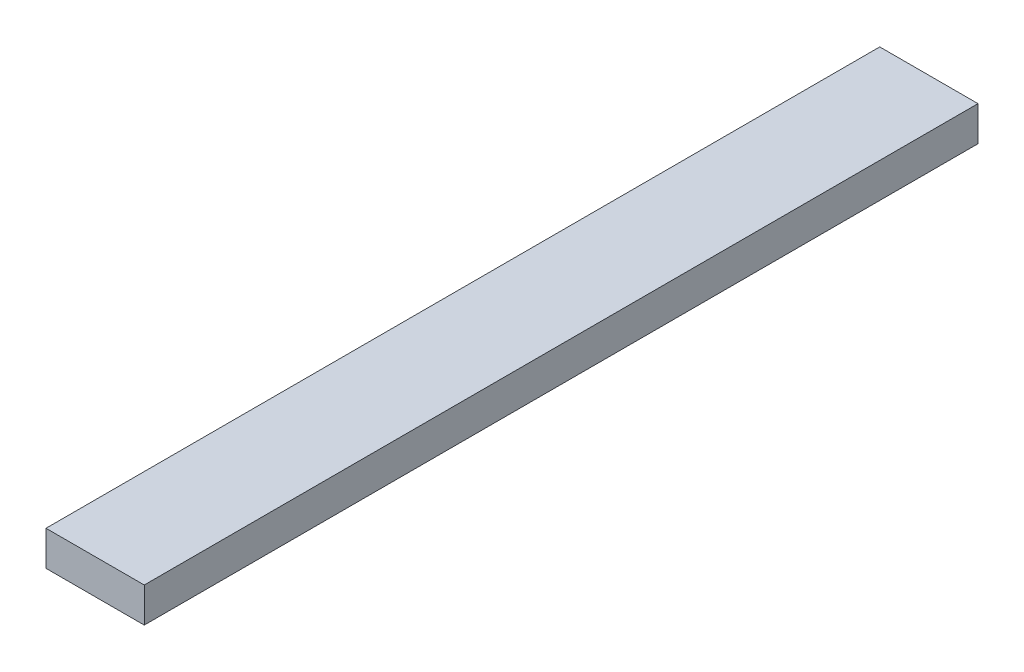
ISO-10303-21;
HEADER;
FILE_DESCRIPTION(('STEP AP214'),'2;1');
FILE_NAME('part.step','',(''),(''),'','','');
FILE_SCHEMA(('AUTOMOTIVE_DESIGN { 1 0 10303 214 1 1 1 1 }'));
ENDSEC;
DATA;
#1=APPLICATION_CONTEXT('core data for automotive mechanical design processes');
#2=APPLICATION_PROTOCOL_DEFINITION('international standard','automotive_design',2000,#1);
#3=PRODUCT_CONTEXT('',#1,'mechanical');
#4=PRODUCT('Part','Part','',(#3));
#5=PRODUCT_RELATED_PRODUCT_CATEGORY('part','',(#4));
#6=PRODUCT_DEFINITION_FORMATION('','',#4);
#7=PRODUCT_DEFINITION_CONTEXT('part definition',#1,'design');
#8=PRODUCT_DEFINITION('design','',#6,#7);
#9=PRODUCT_DEFINITION_SHAPE('','',#8);
#10=(LENGTH_UNIT() NAMED_UNIT(*) SI_UNIT(.MILLI.,.METRE.));
#11=(NAMED_UNIT(*) PLANE_ANGLE_UNIT() SI_UNIT($,.RADIAN.));
#12=(NAMED_UNIT(*) SI_UNIT($,.STERADIAN.) SOLID_ANGLE_UNIT());
#13=UNCERTAINTY_MEASURE_WITH_UNIT(LENGTH_MEASURE(1.E-05),#10,'distance_accuracy_value','');
#14=(GEOMETRIC_REPRESENTATION_CONTEXT(3) GLOBAL_UNCERTAINTY_ASSIGNED_CONTEXT((#13)) GLOBAL_UNIT_ASSIGNED_CONTEXT((#10,
#11,#12)) REPRESENTATION_CONTEXT('',''));
#15=CARTESIAN_POINT('',(0.,0.,0.));
#16=DIRECTION('',(0.,0.,1.));
#17=DIRECTION('',(1.,0.,0.));
#18=AXIS2_PLACEMENT_3D('',#15,#16,#17);
#19=CARTESIAN_POINT('',(0.,0.,152.4));
#20=DIRECTION('',(1.,0.,0.));
#21=DIRECTION('',(0.,0.,-1.));
#22=AXIS2_PLACEMENT_3D('',#19,#20,#21);
#23=PLANE('',#22);
#24=DIRECTION('',(0.,-1.,0.));
#25=VECTOR('',#24,1.);
#26=CARTESIAN_POINT('',(0.,0.,0.));
#27=LINE('',#26,#25);
#28=CARTESIAN_POINT('',(0.,6.35,0.));
#29=VERTEX_POINT('',#28);
#30=CARTESIAN_POINT('',(0.,0.,0.));
#31=VERTEX_POINT('',#30);
#32=EDGE_CURVE('E107',#29,#31,#27,.T.);
#33=ORIENTED_EDGE('',*,*,#32,.T.);
#34=DIRECTION('',(0.,0.,-1.));
#35=VECTOR('',#34,1.);
#36=CARTESIAN_POINT('',(0.,0.,152.4));
#37=LINE('',#36,#35);
#38=CARTESIAN_POINT('',(0.,0.,152.4));
#39=VERTEX_POINT('',#38);
#40=EDGE_CURVE('E11',#39,#31,#37,.T.);
#41=ORIENTED_EDGE('',*,*,#40,.F.);
#42=DIRECTION('',(0.,-1.,0.));
#43=VECTOR('',#42,1.);
#44=CARTESIAN_POINT('',(0.,0.,152.4));
#45=LINE('',#44,#43);
#46=CARTESIAN_POINT('',(0.,6.35,152.4));
#47=VERTEX_POINT('',#46);
#48=EDGE_CURVE('E91',#47,#39,#45,.T.);
#49=ORIENTED_EDGE('',*,*,#48,.F.);
#50=DIRECTION('',(0.,0.,-1.));
#51=VECTOR('',#50,1.);
#52=CARTESIAN_POINT('',(0.,6.35,152.4));
#53=LINE('',#52,#51);
#54=EDGE_CURVE('E103',#47,#29,#53,.T.);
#55=ORIENTED_EDGE('',*,*,#54,.T.);
#56=EDGE_LOOP('',(#33,#41,#49,#55));
#57=FACE_BOUND('',#56,.T.);
#58=ADVANCED_FACE('F39',(#57),#23,.F.);
#59=CARTESIAN_POINT('',(0.,0.,152.4));
#60=DIRECTION('',(0.,1.,0.));
#61=DIRECTION('',(0.,0.,1.));
#62=AXIS2_PLACEMENT_3D('',#59,#60,#61);
#63=PLANE('',#62);
#64=DIRECTION('',(1.,0.,0.));
#65=VECTOR('',#64,1.);
#66=CARTESIAN_POINT('',(0.,0.,0.));
#67=LINE('',#66,#65);
#68=CARTESIAN_POINT('',(17.960512241972,0.,0.));
#69=VERTEX_POINT('',#68);
#70=EDGE_CURVE('E96',#31,#69,#67,.T.);
#71=ORIENTED_EDGE('',*,*,#70,.T.);
#72=DIRECTION('',(0.,0.,-1.));
#73=VECTOR('',#72,1.);
#74=CARTESIAN_POINT('',(17.960512241972,0.,152.4));
#75=LINE('',#74,#73);
#76=CARTESIAN_POINT('',(17.960512241972,0.,152.4));
#77=VERTEX_POINT('',#76);
#78=EDGE_CURVE('E48',#77,#69,#75,.T.);
#79=ORIENTED_EDGE('',*,*,#78,.F.);
#80=DIRECTION('',(1.,0.,0.));
#81=VECTOR('',#80,1.);
#82=CARTESIAN_POINT('',(0.,0.,152.4));
#83=LINE('',#82,#81);
#84=EDGE_CURVE('E86',#39,#77,#83,.T.);
#85=ORIENTED_EDGE('',*,*,#84,.F.);
#86=ORIENTED_EDGE('',*,*,#40,.T.);
#87=EDGE_LOOP('',(#71,#79,#85,#86));
#88=FACE_BOUND('',#87,.T.);
#89=ADVANCED_FACE('F95',(#88),#63,.F.);
#90=CARTESIAN_POINT('',(17.960512241972,0.,152.4));
#91=DIRECTION('',(-1.,0.,0.));
#92=DIRECTION('',(0.,0.,1.));
#93=AXIS2_PLACEMENT_3D('',#90,#91,#92);
#94=PLANE('',#93);
#95=DIRECTION('',(0.,1.,0.));
#96=VECTOR('',#95,1.);
#97=CARTESIAN_POINT('',(17.960512241972,0.,0.));
#98=LINE('',#97,#96);
#99=CARTESIAN_POINT('',(17.960512241972,6.35,0.));
#100=VERTEX_POINT('',#99);
#101=EDGE_CURVE('E73',#69,#100,#98,.T.);
#102=ORIENTED_EDGE('',*,*,#101,.T.);
#103=DIRECTION('',(0.,0.,-1.));
#104=VECTOR('',#103,1.);
#105=CARTESIAN_POINT('',(17.960512241972,6.35,152.4));
#106=LINE('',#105,#104);
#107=CARTESIAN_POINT('',(17.960512241972,6.35,152.4));
#108=VERTEX_POINT('',#107);
#109=EDGE_CURVE('E98',#108,#100,#106,.T.);
#110=ORIENTED_EDGE('',*,*,#109,.F.);
#111=DIRECTION('',(0.,1.,0.));
#112=VECTOR('',#111,1.);
#113=CARTESIAN_POINT('',(17.960512241972,0.,152.4));
#114=LINE('',#113,#112);
#115=EDGE_CURVE('E89',#77,#108,#114,.T.);
#116=ORIENTED_EDGE('',*,*,#115,.F.);
#117=ORIENTED_EDGE('',*,*,#78,.T.);
#118=EDGE_LOOP('',(#102,#110,#116,#117));
#119=FACE_BOUND('',#118,.T.);
#120=ADVANCED_FACE('F99',(#119),#94,.F.);
#121=CARTESIAN_POINT('',(0.,6.35,152.4));
#122=DIRECTION('',(0.,-1.,0.));
#123=DIRECTION('',(0.,0.,-1.));
#124=AXIS2_PLACEMENT_3D('',#121,#122,#123);
#125=PLANE('',#124);
#126=DIRECTION('',(-1.,0.,0.));
#127=VECTOR('',#126,1.);
#128=CARTESIAN_POINT('',(0.,6.35,0.));
#129=LINE('',#128,#127);
#130=EDGE_CURVE('E79',#100,#29,#129,.T.);
#131=ORIENTED_EDGE('',*,*,#130,.T.);
#132=ORIENTED_EDGE('',*,*,#54,.F.);
#133=DIRECTION('',(-1.,0.,0.));
#134=VECTOR('',#133,1.);
#135=CARTESIAN_POINT('',(0.,6.35,152.4));
#136=LINE('',#135,#134);
#137=EDGE_CURVE('E56',#108,#47,#136,.T.);
#138=ORIENTED_EDGE('',*,*,#137,.F.);
#139=ORIENTED_EDGE('',*,*,#109,.T.);
#140=EDGE_LOOP('',(#131,#132,#138,#139));
#141=FACE_BOUND('',#140,.T.);
#142=ADVANCED_FACE('F120',(#141),#125,.F.);
#143=CARTESIAN_POINT('',(0.,0.,152.4));
#144=DIRECTION('',(0.,0.,-1.));
#145=DIRECTION('',(-1.,0.,0.));
#146=AXIS2_PLACEMENT_3D('',#143,#144,#145);
#147=PLANE('',#146);
#148=ORIENTED_EDGE('',*,*,#48,.T.);
#149=ORIENTED_EDGE('',*,*,#84,.T.);
#150=ORIENTED_EDGE('',*,*,#115,.T.);
#151=ORIENTED_EDGE('',*,*,#137,.T.);
#152=EDGE_LOOP('',(#148,#149,#150,#151));
#153=FACE_BOUND('',#152,.T.);
#154=ADVANCED_FACE('F87',(#153),#147,.F.);
#155=CARTESIAN_POINT('',(0.,0.,0.));
#156=DIRECTION('',(0.,0.,-1.));
#157=DIRECTION('',(-1.,0.,0.));
#158=AXIS2_PLACEMENT_3D('',#155,#156,#157);
#159=PLANE('',#158);
#160=ORIENTED_EDGE('',*,*,#32,.F.);
#161=ORIENTED_EDGE('',*,*,#130,.F.);
#162=ORIENTED_EDGE('',*,*,#101,.F.);
#163=ORIENTED_EDGE('',*,*,#70,.F.);
#164=EDGE_LOOP('',(#160,#161,#162,#163));
#165=FACE_BOUND('',#164,.T.);
#166=ADVANCED_FACE('F123',(#165),#159,.T.);
#167=CLOSED_SHELL('',(#58,#89,#120,#142,#154,#166));
#168=MANIFOLD_SOLID_BREP('B2',#167);
#169=ADVANCED_BREP_SHAPE_REPRESENTATION('',(#18,#168),#14);
#170=SHAPE_DEFINITION_REPRESENTATION(#9,#169);
ENDSEC;
END-ISO-10303-21;
